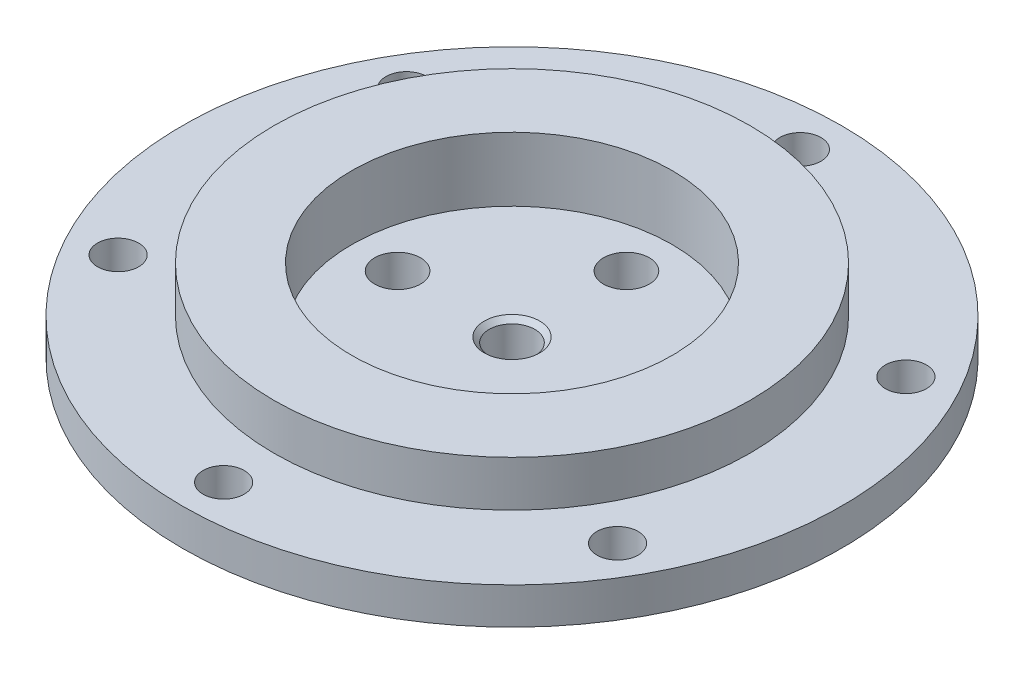
ISO-10303-21;
HEADER;
FILE_DESCRIPTION(('STEP AP214'),'2;1');
FILE_NAME('part.step','',(''),(''),'','','');
FILE_SCHEMA(('AUTOMOTIVE_DESIGN { 1 0 10303 214 1 1 1 1 }'));
ENDSEC;
DATA;
#1=APPLICATION_CONTEXT('core data for automotive mechanical design processes');
#2=APPLICATION_PROTOCOL_DEFINITION('international standard','automotive_design',2000,#1);
#3=PRODUCT_CONTEXT('',#1,'mechanical');
#4=PRODUCT('Part','Part','',(#3));
#5=PRODUCT_RELATED_PRODUCT_CATEGORY('part','',(#4));
#6=PRODUCT_DEFINITION_FORMATION('','',#4);
#7=PRODUCT_DEFINITION_CONTEXT('part definition',#1,'design');
#8=PRODUCT_DEFINITION('design','',#6,#7);
#9=PRODUCT_DEFINITION_SHAPE('','',#8);
#10=(LENGTH_UNIT() NAMED_UNIT(*) SI_UNIT(.MILLI.,.METRE.));
#11=(NAMED_UNIT(*) PLANE_ANGLE_UNIT() SI_UNIT($,.RADIAN.));
#12=(NAMED_UNIT(*) SI_UNIT($,.STERADIAN.) SOLID_ANGLE_UNIT());
#13=UNCERTAINTY_MEASURE_WITH_UNIT(LENGTH_MEASURE(1.E-05),#10,'distance_accuracy_value','');
#14=(GEOMETRIC_REPRESENTATION_CONTEXT(3) GLOBAL_UNCERTAINTY_ASSIGNED_CONTEXT((#13)) GLOBAL_UNIT_ASSIGNED_CONTEXT((#10,
#11,#12)) REPRESENTATION_CONTEXT('',''));
#15=CARTESIAN_POINT('',(0.,0.,0.));
#16=DIRECTION('',(0.,0.,1.));
#17=DIRECTION('',(1.,0.,0.));
#18=AXIS2_PLACEMENT_3D('',#15,#16,#17);
#19=CARTESIAN_POINT('',(0.,0.,0.));
#20=DIRECTION('',(0.,-1.,0.));
#21=DIRECTION('',(0.,0.,-1.));
#22=AXIS2_PLACEMENT_3D('',#19,#20,#21);
#23=CYLINDRICAL_SURFACE('',#22,17.5);
#24=CARTESIAN_POINT('',(0.,2.,0.));
#25=DIRECTION('',(0.,-1.,0.));
#26=DIRECTION('',(0.,0.,-1.));
#27=AXIS2_PLACEMENT_3D('',#24,#25,#26);
#28=CIRCLE('',#27,17.5);
#29=CARTESIAN_POINT('',(0.,2.,-17.5));
#30=VERTEX_POINT('',#29);
#31=EDGE_CURVE('E10',#30,#30,#28,.T.);
#32=ORIENTED_EDGE('',*,*,#31,.T.);
#33=EDGE_LOOP('',(#32));
#34=FACE_BOUND('',#33,.T.);
#35=CARTESIAN_POINT('',(0.,9.,0.));
#36=DIRECTION('',(0.,-1.,0.));
#37=DIRECTION('',(0.,0.,-1.));
#38=AXIS2_PLACEMENT_3D('',#35,#36,#37);
#39=CIRCLE('',#38,17.5);
#40=CARTESIAN_POINT('',(0.,9.,-17.5));
#41=VERTEX_POINT('',#40);
#42=EDGE_CURVE('E105',#41,#41,#39,.T.);
#43=ORIENTED_EDGE('',*,*,#42,.F.);
#44=EDGE_LOOP('',(#43));
#45=FACE_BOUND('',#44,.T.);
#46=ADVANCED_FACE('F37',(#34,#45),#23,.F.);
#47=CARTESIAN_POINT('',(0.,2.,0.));
#48=DIRECTION('',(0.,1.,0.));
#49=DIRECTION('',(0.,0.,1.));
#50=AXIS2_PLACEMENT_3D('',#47,#48,#49);
#51=PLANE('',#50);
#52=CARTESIAN_POINT('',(0.,2.,0.));
#53=DIRECTION('',(0.,1.,0.));
#54=DIRECTION('',(0.,0.,1.));
#55=AXIS2_PLACEMENT_3D('',#52,#53,#54);
#56=CIRCLE('',#55,3.025);
#57=CARTESIAN_POINT('',(0.,2.,3.025));
#58=VERTEX_POINT('',#57);
#59=EDGE_CURVE('E349',#58,#58,#56,.T.);
#60=ORIENTED_EDGE('',*,*,#59,.F.);
#61=EDGE_LOOP('',(#60));
#62=FACE_BOUND('',#61,.T.);
#63=CARTESIAN_POINT('',(12.5,2.,0.));
#64=DIRECTION('',(0.,1.,0.));
#65=DIRECTION('',(0.,0.,1.));
#66=AXIS2_PLACEMENT_3D('',#63,#64,#65);
#67=CIRCLE('',#66,2.5);
#68=CARTESIAN_POINT('',(12.5,2.,2.5));
#69=VERTEX_POINT('',#68);
#70=EDGE_CURVE('E57',#69,#69,#67,.T.);
#71=ORIENTED_EDGE('',*,*,#70,.F.);
#72=EDGE_LOOP('',(#71));
#73=FACE_BOUND('',#72,.T.);
#74=CARTESIAN_POINT('',(0.,2.,12.5));
#75=DIRECTION('',(0.,1.,0.));
#76=DIRECTION('',(0.,0.,1.));
#77=AXIS2_PLACEMENT_3D('',#74,#75,#76);
#78=CIRCLE('',#77,2.5);
#79=CARTESIAN_POINT('',(0.,2.,15.));
#80=VERTEX_POINT('',#79);
#81=EDGE_CURVE('E359',#80,#80,#78,.T.);
#82=ORIENTED_EDGE('',*,*,#81,.F.);
#83=EDGE_LOOP('',(#82));
#84=FACE_BOUND('',#83,.T.);
#85=CARTESIAN_POINT('',(-12.5,2.,0.));
#86=DIRECTION('',(0.,1.,0.));
#87=DIRECTION('',(0.,0.,1.));
#88=AXIS2_PLACEMENT_3D('',#85,#86,#87);
#89=CIRCLE('',#88,2.49999999999999);
#90=CARTESIAN_POINT('',(-12.5,2.,2.5));
#91=VERTEX_POINT('',#90);
#92=EDGE_CURVE('E362',#91,#91,#89,.T.);
#93=ORIENTED_EDGE('',*,*,#92,.F.);
#94=EDGE_LOOP('',(#93));
#95=FACE_BOUND('',#94,.T.);
#96=CARTESIAN_POINT('',(0.,2.,-12.5));
#97=DIRECTION('',(0.,1.,0.));
#98=DIRECTION('',(0.,0.,1.));
#99=AXIS2_PLACEMENT_3D('',#96,#97,#98);
#100=CIRCLE('',#99,2.5);
#101=CARTESIAN_POINT('',(0.,2.,-10.));
#102=VERTEX_POINT('',#101);
#103=EDGE_CURVE('E356',#102,#102,#100,.T.);
#104=ORIENTED_EDGE('',*,*,#103,.F.);
#105=EDGE_LOOP('',(#104));
#106=FACE_BOUND('',#105,.T.);
#107=ORIENTED_EDGE('',*,*,#31,.F.);
#108=EDGE_LOOP('',(#107));
#109=FACE_BOUND('',#108,.T.);
#110=ADVANCED_FACE('F156',(#62,#73,#84,#95,#106,#109),#51,.T.);
#111=CARTESIAN_POINT('',(0.,-4.,0.));
#112=DIRECTION('',(0.,1.,0.));
#113=DIRECTION('',(0.,0.,1.));
#114=AXIS2_PLACEMENT_3D('',#111,#112,#113);
#115=PLANE('',#114);
#116=CARTESIAN_POINT('',(0.,-4.,0.));
#117=DIRECTION('',(0.,1.,0.));
#118=DIRECTION('',(0.,0.,1.));
#119=AXIS2_PLACEMENT_3D('',#116,#117,#118);
#120=CIRCLE('',#119,2.5);
#121=CARTESIAN_POINT('',(0.,-4.,2.5));
#122=VERTEX_POINT('',#121);
#123=EDGE_CURVE('E351',#122,#122,#120,.T.);
#124=ORIENTED_EDGE('',*,*,#123,.T.);
#125=EDGE_LOOP('',(#124));
#126=FACE_BOUND('',#125,.T.);
#127=CARTESIAN_POINT('',(12.5,-4.,0.));
#128=DIRECTION('',(0.,1.,0.));
#129=DIRECTION('',(0.,0.,1.));
#130=AXIS2_PLACEMENT_3D('',#127,#128,#129);
#131=CIRCLE('',#130,2.5);
#132=CARTESIAN_POINT('',(12.5,-4.,2.5));
#133=VERTEX_POINT('',#132);
#134=EDGE_CURVE('E40',#133,#133,#131,.T.);
#135=ORIENTED_EDGE('',*,*,#134,.T.);
#136=EDGE_LOOP('',(#135));
#137=FACE_BOUND('',#136,.T.);
#138=CARTESIAN_POINT('',(0.,-4.,12.5));
#139=DIRECTION('',(0.,1.,0.));
#140=DIRECTION('',(0.,0.,1.));
#141=AXIS2_PLACEMENT_3D('',#138,#139,#140);
#142=CIRCLE('',#141,2.5);
#143=CARTESIAN_POINT('',(0.,-4.,15.));
#144=VERTEX_POINT('',#143);
#145=EDGE_CURVE('E59',#144,#144,#142,.T.);
#146=ORIENTED_EDGE('',*,*,#145,.T.);
#147=EDGE_LOOP('',(#146));
#148=FACE_BOUND('',#147,.T.);
#149=CARTESIAN_POINT('',(-12.5,-4.,0.));
#150=DIRECTION('',(0.,1.,0.));
#151=DIRECTION('',(0.,0.,1.));
#152=AXIS2_PLACEMENT_3D('',#149,#150,#151);
#153=CIRCLE('',#152,2.49999999999999);
#154=CARTESIAN_POINT('',(-12.5,-4.,2.5));
#155=VERTEX_POINT('',#154);
#156=EDGE_CURVE('E56',#155,#155,#153,.T.);
#157=ORIENTED_EDGE('',*,*,#156,.T.);
#158=EDGE_LOOP('',(#157));
#159=FACE_BOUND('',#158,.T.);
#160=CARTESIAN_POINT('',(0.,-4.,-12.5));
#161=DIRECTION('',(0.,1.,0.));
#162=DIRECTION('',(0.,0.,1.));
#163=AXIS2_PLACEMENT_3D('',#160,#161,#162);
#164=CIRCLE('',#163,2.5);
#165=CARTESIAN_POINT('',(0.,-4.,-10.));
#166=VERTEX_POINT('',#165);
#167=EDGE_CURVE('E53',#166,#166,#164,.T.);
#168=ORIENTED_EDGE('',*,*,#167,.T.);
#169=EDGE_LOOP('',(#168));
#170=FACE_BOUND('',#169,.T.);
#171=CARTESIAN_POINT('',(0.,-4.,0.));
#172=DIRECTION('',(0.,-1.,0.));
#173=DIRECTION('',(0.,0.,-1.));
#174=AXIS2_PLACEMENT_3D('',#171,#172,#173);
#175=CIRCLE('',#174,27.5);
#176=CARTESIAN_POINT('',(0.,-4.,-27.5));
#177=VERTEX_POINT('',#176);
#178=EDGE_CURVE('E44',#177,#177,#175,.T.);
#179=ORIENTED_EDGE('',*,*,#178,.T.);
#180=EDGE_LOOP('',(#179));
#181=FACE_BOUND('',#180,.T.);
#182=ADVANCED_FACE('F160',(#126,#137,#148,#159,#170,#181),#115,.F.);
#183=CARTESIAN_POINT('',(0.,0.,0.));
#184=DIRECTION('',(0.,-1.,0.));
#185=DIRECTION('',(0.,0.,-1.));
#186=AXIS2_PLACEMENT_3D('',#183,#184,#185);
#187=CYLINDRICAL_SURFACE('',#186,27.5);
#188=ORIENTED_EDGE('',*,*,#178,.F.);
#189=EDGE_LOOP('',(#188));
#190=FACE_BOUND('',#189,.T.);
#191=CARTESIAN_POINT('',(0.,0.,0.));
#192=DIRECTION('',(0.,-1.,0.));
#193=DIRECTION('',(0.,0.,-1.));
#194=AXIS2_PLACEMENT_3D('',#191,#192,#193);
#195=CIRCLE('',#194,27.5);
#196=CARTESIAN_POINT('',(0.,0.,-27.5));
#197=VERTEX_POINT('',#196);
#198=EDGE_CURVE('E49',#197,#197,#195,.T.);
#199=ORIENTED_EDGE('',*,*,#198,.T.);
#200=EDGE_LOOP('',(#199));
#201=FACE_BOUND('',#200,.T.);
#202=ADVANCED_FACE('F122',(#190,#201),#187,.T.);
#203=CARTESIAN_POINT('',(0.,0.,0.));
#204=DIRECTION('',(0.,1.,0.));
#205=DIRECTION('',(0.,0.,1.));
#206=AXIS2_PLACEMENT_3D('',#203,#204,#205);
#207=PLANE('',#206);
#208=CARTESIAN_POINT('',(0.,0.,-31.5));
#209=DIRECTION('',(0.,1.,0.));
#210=DIRECTION('',(0.,0.,1.));
#211=AXIS2_PLACEMENT_3D('',#208,#209,#210);
#212=CIRCLE('',#211,2.25);
#213=CARTESIAN_POINT('',(0.,0.,-29.25));
#214=VERTEX_POINT('',#213);
#215=EDGE_CURVE('E102',#214,#214,#212,.T.);
#216=ORIENTED_EDGE('',*,*,#215,.T.);
#217=EDGE_LOOP('',(#216));
#218=FACE_BOUND('',#217,.T.);
#219=CARTESIAN_POINT('',(-27.2798002192098,0.,-15.75));
#220=DIRECTION('',(0.,1.,0.));
#221=DIRECTION('',(0.,0.,1.));
#222=AXIS2_PLACEMENT_3D('',#219,#220,#221);
#223=CIRCLE('',#222,2.25);
#224=CARTESIAN_POINT('',(-27.2798002192098,0.,-13.5));
#225=VERTEX_POINT('',#224);
#226=EDGE_CURVE('E99',#225,#225,#223,.T.);
#227=ORIENTED_EDGE('',*,*,#226,.T.);
#228=EDGE_LOOP('',(#227));
#229=FACE_BOUND('',#228,.T.);
#230=CARTESIAN_POINT('',(-27.2798002192098,0.,15.75));
#231=DIRECTION('',(0.,1.,0.));
#232=DIRECTION('',(0.,0.,1.));
#233=AXIS2_PLACEMENT_3D('',#230,#231,#232);
#234=CIRCLE('',#233,2.25);
#235=CARTESIAN_POINT('',(-27.2798002192098,0.,18.));
#236=VERTEX_POINT('',#235);
#237=EDGE_CURVE('E96',#236,#236,#234,.T.);
#238=ORIENTED_EDGE('',*,*,#237,.T.);
#239=EDGE_LOOP('',(#238));
#240=FACE_BOUND('',#239,.T.);
#241=CARTESIAN_POINT('',(0.,0.,31.5));
#242=DIRECTION('',(0.,1.,0.));
#243=DIRECTION('',(0.,0.,1.));
#244=AXIS2_PLACEMENT_3D('',#241,#242,#243);
#245=CIRCLE('',#244,2.25);
#246=CARTESIAN_POINT('',(0.,0.,33.75));
#247=VERTEX_POINT('',#246);
#248=EDGE_CURVE('E93',#247,#247,#245,.T.);
#249=ORIENTED_EDGE('',*,*,#248,.T.);
#250=EDGE_LOOP('',(#249));
#251=FACE_BOUND('',#250,.T.);
#252=CARTESIAN_POINT('',(27.2798002192098,0.,15.75));
#253=DIRECTION('',(0.,1.,0.));
#254=DIRECTION('',(0.,0.,1.));
#255=AXIS2_PLACEMENT_3D('',#252,#253,#254);
#256=CIRCLE('',#255,2.25);
#257=CARTESIAN_POINT('',(27.2798002192098,0.,18.));
#258=VERTEX_POINT('',#257);
#259=EDGE_CURVE('E90',#258,#258,#256,.T.);
#260=ORIENTED_EDGE('',*,*,#259,.T.);
#261=EDGE_LOOP('',(#260));
#262=FACE_BOUND('',#261,.T.);
#263=CARTESIAN_POINT('',(27.2798002192098,0.,-15.75));
#264=DIRECTION('',(0.,1.,0.));
#265=DIRECTION('',(0.,0.,1.));
#266=AXIS2_PLACEMENT_3D('',#263,#264,#265);
#267=CIRCLE('',#266,2.25);
#268=CARTESIAN_POINT('',(27.2798002192098,0.,-13.5));
#269=VERTEX_POINT('',#268);
#270=EDGE_CURVE('E87',#269,#269,#267,.T.);
#271=ORIENTED_EDGE('',*,*,#270,.T.);
#272=EDGE_LOOP('',(#271));
#273=FACE_BOUND('',#272,.T.);
#274=ORIENTED_EDGE('',*,*,#198,.F.);
#275=EDGE_LOOP('',(#274));
#276=FACE_BOUND('',#275,.T.);
#277=CARTESIAN_POINT('',(0.,0.,0.));
#278=DIRECTION('',(0.,-1.,0.));
#279=DIRECTION('',(0.,0.,-1.));
#280=AXIS2_PLACEMENT_3D('',#277,#278,#279);
#281=CIRCLE('',#280,36.);
#282=CARTESIAN_POINT('',(0.,0.,-36.));
#283=VERTEX_POINT('',#282);
#284=EDGE_CURVE('E117',#283,#283,#281,.T.);
#285=ORIENTED_EDGE('',*,*,#284,.T.);
#286=EDGE_LOOP('',(#285));
#287=FACE_BOUND('',#286,.T.);
#288=ADVANCED_FACE('F124',(#218,#229,#240,#251,#262,#273,#276,#287),#207,.F.);
#289=CARTESIAN_POINT('',(0.,0.,0.));
#290=DIRECTION('',(0.,-1.,0.));
#291=DIRECTION('',(0.,0.,-1.));
#292=AXIS2_PLACEMENT_3D('',#289,#290,#291);
#293=CYLINDRICAL_SURFACE('',#292,36.);
#294=ORIENTED_EDGE('',*,*,#284,.F.);
#295=EDGE_LOOP('',(#294));
#296=FACE_BOUND('',#295,.T.);
#297=CARTESIAN_POINT('',(0.,4.,0.));
#298=DIRECTION('',(0.,-1.,0.));
#299=DIRECTION('',(0.,0.,-1.));
#300=AXIS2_PLACEMENT_3D('',#297,#298,#299);
#301=CIRCLE('',#300,36.);
#302=CARTESIAN_POINT('',(0.,4.,-36.));
#303=VERTEX_POINT('',#302);
#304=EDGE_CURVE('E114',#303,#303,#301,.T.);
#305=ORIENTED_EDGE('',*,*,#304,.T.);
#306=EDGE_LOOP('',(#305));
#307=FACE_BOUND('',#306,.T.);
#308=ADVANCED_FACE('F127',(#296,#307),#293,.T.);
#309=CARTESIAN_POINT('',(0.,4.,0.));
#310=DIRECTION('',(0.,-1.,0.));
#311=DIRECTION('',(0.,0.,-1.));
#312=AXIS2_PLACEMENT_3D('',#309,#310,#311);
#313=PLANE('',#312);
#314=CARTESIAN_POINT('',(0.,4.,-31.5));
#315=DIRECTION('',(0.,1.,0.));
#316=DIRECTION('',(0.,0.,1.));
#317=AXIS2_PLACEMENT_3D('',#314,#315,#316);
#318=CIRCLE('',#317,2.25);
#319=CARTESIAN_POINT('',(0.,4.,-29.25));
#320=VERTEX_POINT('',#319);
#321=EDGE_CURVE('E77',#320,#320,#318,.T.);
#322=ORIENTED_EDGE('',*,*,#321,.F.);
#323=EDGE_LOOP('',(#322));
#324=FACE_BOUND('',#323,.T.);
#325=CARTESIAN_POINT('',(-27.2798002192098,4.,-15.75));
#326=DIRECTION('',(0.,1.,0.));
#327=DIRECTION('',(0.,0.,1.));
#328=AXIS2_PLACEMENT_3D('',#325,#326,#327);
#329=CIRCLE('',#328,2.25);
#330=CARTESIAN_POINT('',(-27.2798002192098,4.,-13.5));
#331=VERTEX_POINT('',#330);
#332=EDGE_CURVE('E64',#331,#331,#329,.T.);
#333=ORIENTED_EDGE('',*,*,#332,.F.);
#334=EDGE_LOOP('',(#333));
#335=FACE_BOUND('',#334,.T.);
#336=CARTESIAN_POINT('',(-27.2798002192098,4.,15.75));
#337=DIRECTION('',(0.,1.,0.));
#338=DIRECTION('',(0.,0.,1.));
#339=AXIS2_PLACEMENT_3D('',#336,#337,#338);
#340=CIRCLE('',#339,2.25);
#341=CARTESIAN_POINT('',(-27.2798002192098,4.,18.));
#342=VERTEX_POINT('',#341);
#343=EDGE_CURVE('E68',#342,#342,#340,.T.);
#344=ORIENTED_EDGE('',*,*,#343,.F.);
#345=EDGE_LOOP('',(#344));
#346=FACE_BOUND('',#345,.T.);
#347=CARTESIAN_POINT('',(0.,4.,31.5));
#348=DIRECTION('',(0.,1.,0.));
#349=DIRECTION('',(0.,0.,1.));
#350=AXIS2_PLACEMENT_3D('',#347,#348,#349);
#351=CIRCLE('',#350,2.25);
#352=CARTESIAN_POINT('',(0.,4.,33.75));
#353=VERTEX_POINT('',#352);
#354=EDGE_CURVE('E73',#353,#353,#351,.T.);
#355=ORIENTED_EDGE('',*,*,#354,.F.);
#356=EDGE_LOOP('',(#355));
#357=FACE_BOUND('',#356,.T.);
#358=CARTESIAN_POINT('',(27.2798002192098,4.,15.75));
#359=DIRECTION('',(0.,1.,0.));
#360=DIRECTION('',(0.,0.,1.));
#361=AXIS2_PLACEMENT_3D('',#358,#359,#360);
#362=CIRCLE('',#361,2.25);
#363=CARTESIAN_POINT('',(27.2798002192098,4.,18.));
#364=VERTEX_POINT('',#363);
#365=EDGE_CURVE('E82',#364,#364,#362,.T.);
#366=ORIENTED_EDGE('',*,*,#365,.F.);
#367=EDGE_LOOP('',(#366));
#368=FACE_BOUND('',#367,.T.);
#369=CARTESIAN_POINT('',(27.2798002192098,4.,-15.75));
#370=DIRECTION('',(0.,1.,0.));
#371=DIRECTION('',(0.,0.,1.));
#372=AXIS2_PLACEMENT_3D('',#369,#370,#371);
#373=CIRCLE('',#372,2.25);
#374=CARTESIAN_POINT('',(27.2798002192098,4.,-13.5));
#375=VERTEX_POINT('',#374);
#376=EDGE_CURVE('E79',#375,#375,#373,.T.);
#377=ORIENTED_EDGE('',*,*,#376,.F.);
#378=EDGE_LOOP('',(#377));
#379=FACE_BOUND('',#378,.T.);
#380=ORIENTED_EDGE('',*,*,#304,.F.);
#381=EDGE_LOOP('',(#380));
#382=FACE_BOUND('',#381,.T.);
#383=CARTESIAN_POINT('',(0.,4.,0.));
#384=DIRECTION('',(0.,-1.,0.));
#385=DIRECTION('',(0.,0.,-1.));
#386=AXIS2_PLACEMENT_3D('',#383,#384,#385);
#387=CIRCLE('',#386,26.);
#388=CARTESIAN_POINT('',(0.,4.,-26.));
#389=VERTEX_POINT('',#388);
#390=EDGE_CURVE('E111',#389,#389,#387,.T.);
#391=ORIENTED_EDGE('',*,*,#390,.T.);
#392=EDGE_LOOP('',(#391));
#393=FACE_BOUND('',#392,.T.);
#394=ADVANCED_FACE('F134',(#324,#335,#346,#357,#368,#379,#382,#393),#313,.F.);
#395=CARTESIAN_POINT('',(0.,0.,0.));
#396=DIRECTION('',(0.,-1.,0.));
#397=DIRECTION('',(0.,0.,-1.));
#398=AXIS2_PLACEMENT_3D('',#395,#396,#397);
#399=CYLINDRICAL_SURFACE('',#398,26.);
#400=CARTESIAN_POINT('',(0.,9.,0.));
#401=DIRECTION('',(0.,-1.,0.));
#402=DIRECTION('',(0.,0.,-1.));
#403=AXIS2_PLACEMENT_3D('',#400,#401,#402);
#404=CIRCLE('',#403,26.);
#405=CARTESIAN_POINT('',(0.,9.,-26.));
#406=VERTEX_POINT('',#405);
#407=EDGE_CURVE('E108',#406,#406,#404,.T.);
#408=ORIENTED_EDGE('',*,*,#407,.T.);
#409=EDGE_LOOP('',(#408));
#410=FACE_BOUND('',#409,.T.);
#411=ORIENTED_EDGE('',*,*,#390,.F.);
#412=EDGE_LOOP('',(#411));
#413=FACE_BOUND('',#412,.T.);
#414=ADVANCED_FACE('F140',(#410,#413),#399,.T.);
#415=CARTESIAN_POINT('',(0.,9.,0.));
#416=DIRECTION('',(0.,1.,0.));
#417=DIRECTION('',(0.,0.,1.));
#418=AXIS2_PLACEMENT_3D('',#415,#416,#417);
#419=PLANE('',#418);
#420=ORIENTED_EDGE('',*,*,#42,.T.);
#421=EDGE_LOOP('',(#420));
#422=FACE_BOUND('',#421,.T.);
#423=ORIENTED_EDGE('',*,*,#407,.F.);
#424=EDGE_LOOP('',(#423));
#425=FACE_BOUND('',#424,.T.);
#426=ADVANCED_FACE('F146',(#422,#425),#419,.T.);
#427=CARTESIAN_POINT('',(27.2798002192098,-4.,-15.75));
#428=DIRECTION('',(0.,1.,0.));
#429=DIRECTION('',(0.,0.,1.));
#430=AXIS2_PLACEMENT_3D('',#427,#428,#429);
#431=CYLINDRICAL_SURFACE('',#430,2.25);
#432=ORIENTED_EDGE('',*,*,#376,.T.);
#433=EDGE_LOOP('',(#432));
#434=FACE_BOUND('',#433,.T.);
#435=ORIENTED_EDGE('',*,*,#270,.F.);
#436=EDGE_LOOP('',(#435));
#437=FACE_BOUND('',#436,.T.);
#438=ADVANCED_FACE('F152',(#434,#437),#431,.F.);
#439=CARTESIAN_POINT('',(27.2798002192098,-4.,15.75));
#440=DIRECTION('',(0.,1.,0.));
#441=DIRECTION('',(0.,0.,1.));
#442=AXIS2_PLACEMENT_3D('',#439,#440,#441);
#443=CYLINDRICAL_SURFACE('',#442,2.25);
#444=ORIENTED_EDGE('',*,*,#365,.T.);
#445=EDGE_LOOP('',(#444));
#446=FACE_BOUND('',#445,.T.);
#447=ORIENTED_EDGE('',*,*,#259,.F.);
#448=EDGE_LOOP('',(#447));
#449=FACE_BOUND('',#448,.T.);
#450=ADVANCED_FACE('F205',(#446,#449),#443,.F.);
#451=CARTESIAN_POINT('',(0.,-4.,31.5));
#452=DIRECTION('',(0.,1.,0.));
#453=DIRECTION('',(0.,0.,1.));
#454=AXIS2_PLACEMENT_3D('',#451,#452,#453);
#455=CYLINDRICAL_SURFACE('',#454,2.25);
#456=ORIENTED_EDGE('',*,*,#354,.T.);
#457=EDGE_LOOP('',(#456));
#458=FACE_BOUND('',#457,.T.);
#459=ORIENTED_EDGE('',*,*,#248,.F.);
#460=EDGE_LOOP('',(#459));
#461=FACE_BOUND('',#460,.T.);
#462=ADVANCED_FACE('F216',(#458,#461),#455,.F.);
#463=CARTESIAN_POINT('',(-27.2798002192098,-4.,15.75));
#464=DIRECTION('',(0.,1.,0.));
#465=DIRECTION('',(0.,0.,1.));
#466=AXIS2_PLACEMENT_3D('',#463,#464,#465);
#467=CYLINDRICAL_SURFACE('',#466,2.25);
#468=ORIENTED_EDGE('',*,*,#343,.T.);
#469=EDGE_LOOP('',(#468));
#470=FACE_BOUND('',#469,.T.);
#471=ORIENTED_EDGE('',*,*,#237,.F.);
#472=EDGE_LOOP('',(#471));
#473=FACE_BOUND('',#472,.T.);
#474=ADVANCED_FACE('F226',(#470,#473),#467,.F.);
#475=CARTESIAN_POINT('',(-27.2798002192098,-4.,-15.75));
#476=DIRECTION('',(0.,1.,0.));
#477=DIRECTION('',(0.,0.,1.));
#478=AXIS2_PLACEMENT_3D('',#475,#476,#477);
#479=CYLINDRICAL_SURFACE('',#478,2.25);
#480=ORIENTED_EDGE('',*,*,#332,.T.);
#481=EDGE_LOOP('',(#480));
#482=FACE_BOUND('',#481,.T.);
#483=ORIENTED_EDGE('',*,*,#226,.F.);
#484=EDGE_LOOP('',(#483));
#485=FACE_BOUND('',#484,.T.);
#486=ADVANCED_FACE('F236',(#482,#485),#479,.F.);
#487=CARTESIAN_POINT('',(0.,-4.,-31.5));
#488=DIRECTION('',(0.,1.,0.));
#489=DIRECTION('',(0.,0.,1.));
#490=AXIS2_PLACEMENT_3D('',#487,#488,#489);
#491=CYLINDRICAL_SURFACE('',#490,2.25);
#492=ORIENTED_EDGE('',*,*,#321,.T.);
#493=EDGE_LOOP('',(#492));
#494=FACE_BOUND('',#493,.T.);
#495=ORIENTED_EDGE('',*,*,#215,.F.);
#496=EDGE_LOOP('',(#495));
#497=FACE_BOUND('',#496,.T.);
#498=ADVANCED_FACE('F246',(#494,#497),#491,.F.);
#499=CARTESIAN_POINT('',(0.,-8.,-12.5));
#500=DIRECTION('',(0.,1.,0.));
#501=DIRECTION('',(0.,0.,1.));
#502=AXIS2_PLACEMENT_3D('',#499,#500,#501);
#503=CYLINDRICAL_SURFACE('',#502,2.5);
#504=ORIENTED_EDGE('',*,*,#103,.T.);
#505=EDGE_LOOP('',(#504));
#506=FACE_BOUND('',#505,.T.);
#507=ORIENTED_EDGE('',*,*,#167,.F.);
#508=EDGE_LOOP('',(#507));
#509=FACE_BOUND('',#508,.T.);
#510=ADVANCED_FACE('F255',(#506,#509),#503,.F.);
#511=CARTESIAN_POINT('',(-12.5,-8.,0.));
#512=DIRECTION('',(0.,1.,0.));
#513=DIRECTION('',(0.,0.,1.));
#514=AXIS2_PLACEMENT_3D('',#511,#512,#513);
#515=CYLINDRICAL_SURFACE('',#514,2.49999999999999);
#516=ORIENTED_EDGE('',*,*,#92,.T.);
#517=EDGE_LOOP('',(#516));
#518=FACE_BOUND('',#517,.T.);
#519=ORIENTED_EDGE('',*,*,#156,.F.);
#520=EDGE_LOOP('',(#519));
#521=FACE_BOUND('',#520,.T.);
#522=ADVANCED_FACE('F266',(#518,#521),#515,.F.);
#523=CARTESIAN_POINT('',(0.,-8.,12.5));
#524=DIRECTION('',(0.,1.,0.));
#525=DIRECTION('',(0.,0.,1.));
#526=AXIS2_PLACEMENT_3D('',#523,#524,#525);
#527=CYLINDRICAL_SURFACE('',#526,2.5);
#528=ORIENTED_EDGE('',*,*,#81,.T.);
#529=EDGE_LOOP('',(#528));
#530=FACE_BOUND('',#529,.T.);
#531=ORIENTED_EDGE('',*,*,#145,.F.);
#532=EDGE_LOOP('',(#531));
#533=FACE_BOUND('',#532,.T.);
#534=ADVANCED_FACE('F279',(#530,#533),#527,.F.);
#535=CARTESIAN_POINT('',(12.5,-8.,0.));
#536=DIRECTION('',(0.,1.,0.));
#537=DIRECTION('',(0.,0.,1.));
#538=AXIS2_PLACEMENT_3D('',#535,#536,#537);
#539=CYLINDRICAL_SURFACE('',#538,2.5);
#540=ORIENTED_EDGE('',*,*,#70,.T.);
#541=EDGE_LOOP('',(#540));
#542=FACE_BOUND('',#541,.T.);
#543=ORIENTED_EDGE('',*,*,#134,.F.);
#544=EDGE_LOOP('',(#543));
#545=FACE_BOUND('',#544,.T.);
#546=ADVANCED_FACE('F289',(#542,#545),#539,.F.);
#547=CARTESIAN_POINT('',(0.,-4.,0.));
#548=DIRECTION('',(0.,1.,0.));
#549=DIRECTION('',(0.,0.,1.));
#550=AXIS2_PLACEMENT_3D('',#547,#548,#549);
#551=CYLINDRICAL_SURFACE('',#550,2.5);
#552=CARTESIAN_POINT('',(0.,1.47499999999999,0.));
#553=DIRECTION('',(0.,1.,0.));
#554=DIRECTION('',(0.,0.,1.));
#555=AXIS2_PLACEMENT_3D('',#552,#553,#554);
#556=CIRCLE('',#555,2.49999999999999);
#557=CARTESIAN_POINT('',(0.,1.47499999999999,2.49999999999999));
#558=VERTEX_POINT('',#557);
#559=EDGE_CURVE('E347',#558,#558,#556,.T.);
#560=ORIENTED_EDGE('',*,*,#559,.T.);
#561=EDGE_LOOP('',(#560));
#562=FACE_BOUND('',#561,.T.);
#563=ORIENTED_EDGE('',*,*,#123,.F.);
#564=EDGE_LOOP('',(#563));
#565=FACE_BOUND('',#564,.T.);
#566=ADVANCED_FACE('F299',(#562,#565),#551,.F.);
#567=CARTESIAN_POINT('',(0.,2.,0.));
#568=DIRECTION('',(0.,1.,0.));
#569=DIRECTION('',(0.,0.,1.));
#570=AXIS2_PLACEMENT_3D('',#567,#568,#569);
#571=CONICAL_SURFACE('',#570,3.025,0.785398163397445);
#572=ORIENTED_EDGE('',*,*,#559,.F.);
#573=EDGE_LOOP('',(#572));
#574=FACE_BOUND('',#573,.T.);
#575=ORIENTED_EDGE('',*,*,#59,.T.);
#576=EDGE_LOOP('',(#575));
#577=FACE_BOUND('',#576,.T.);
#578=ADVANCED_FACE('F320',(#574,#577),#571,.F.);
#579=CLOSED_SHELL('',(#46,#110,#182,#202,#288,#308,#394,#414,#426,#438,#450,#462,#474,#486,#498,
#510,#522,#534,#546,#566,#578));
#580=MANIFOLD_SOLID_BREP('B2',#579);
#581=ADVANCED_BREP_SHAPE_REPRESENTATION('',(#18,#580),#14);
#582=SHAPE_DEFINITION_REPRESENTATION(#9,#581);
ENDSEC;
END-ISO-10303-21;
